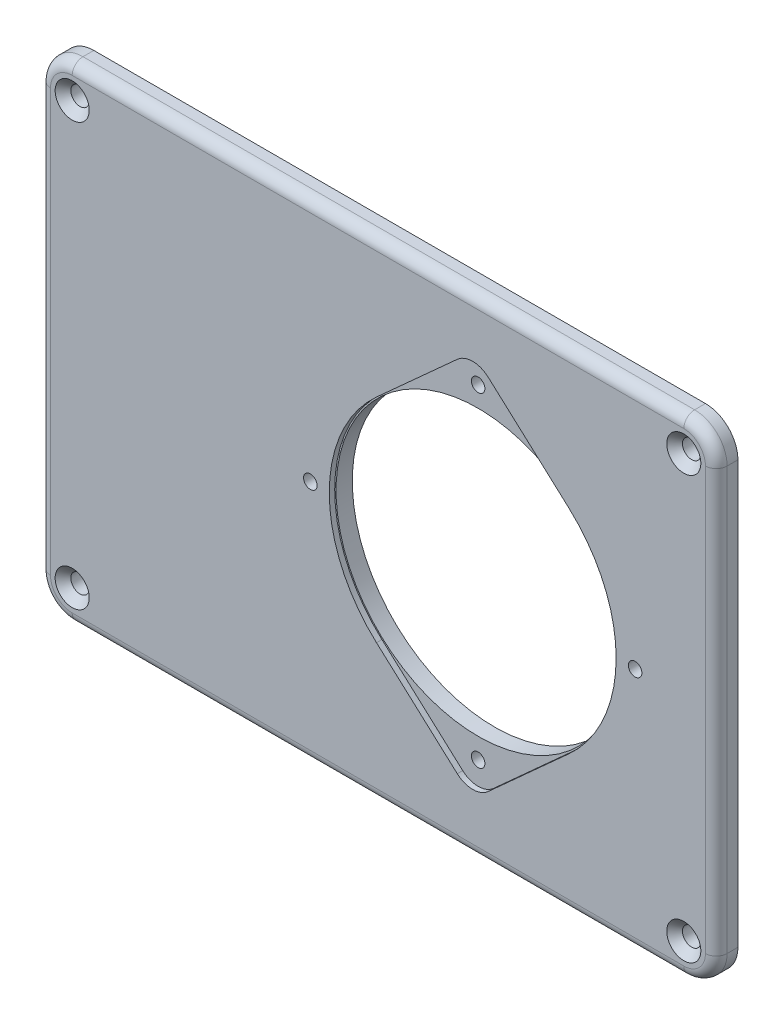
ISO-10303-21;
HEADER;
FILE_DESCRIPTION(('STEP AP214'),'2;1');
FILE_NAME('part.step','',(''),(''),'','','');
FILE_SCHEMA(('AUTOMOTIVE_DESIGN { 1 0 10303 214 1 1 1 1 }'));
ENDSEC;
DATA;
#1=APPLICATION_CONTEXT('core data for automotive mechanical design processes');
#2=APPLICATION_PROTOCOL_DEFINITION('international standard','automotive_design',2000,#1);
#3=PRODUCT_CONTEXT('',#1,'mechanical');
#4=PRODUCT('Part','Part','',(#3));
#5=PRODUCT_RELATED_PRODUCT_CATEGORY('part','',(#4));
#6=PRODUCT_DEFINITION_FORMATION('','',#4);
#7=PRODUCT_DEFINITION_CONTEXT('part definition',#1,'design');
#8=PRODUCT_DEFINITION('design','',#6,#7);
#9=PRODUCT_DEFINITION_SHAPE('','',#8);
#10=(LENGTH_UNIT() NAMED_UNIT(*) SI_UNIT(.MILLI.,.METRE.));
#11=(NAMED_UNIT(*) PLANE_ANGLE_UNIT() SI_UNIT($,.RADIAN.));
#12=(NAMED_UNIT(*) SI_UNIT($,.STERADIAN.) SOLID_ANGLE_UNIT());
#13=UNCERTAINTY_MEASURE_WITH_UNIT(LENGTH_MEASURE(1.E-05),#10,'distance_accuracy_value','');
#14=(GEOMETRIC_REPRESENTATION_CONTEXT(3) GLOBAL_UNCERTAINTY_ASSIGNED_CONTEXT((#13)) GLOBAL_UNIT_ASSIGNED_CONTEXT((#10,
#11,#12)) REPRESENTATION_CONTEXT('',''));
#15=CARTESIAN_POINT('',(0.,0.,0.));
#16=DIRECTION('',(0.,0.,1.));
#17=DIRECTION('',(1.,0.,0.));
#18=AXIS2_PLACEMENT_3D('',#15,#16,#17);
#19=CARTESIAN_POINT('',(17.5,0.,0.));
#20=DIRECTION('',(0.,0.,1.));
#21=DIRECTION('',(1.,0.,0.));
#22=AXIS2_PLACEMENT_3D('',#19,#20,#21);
#23=CYLINDRICAL_SURFACE('',#22,26.25);
#24=CARTESIAN_POINT('',(17.5,0.,0.));
#25=DIRECTION('',(0.,0.,1.));
#26=DIRECTION('',(1.,0.,0.));
#27=AXIS2_PLACEMENT_3D('',#24,#25,#26);
#28=CIRCLE('',#27,26.25);
#29=CARTESIAN_POINT('',(43.75,0.,0.));
#30=VERTEX_POINT('',#29);
#31=EDGE_CURVE('E285',#30,#30,#28,.T.);
#32=ORIENTED_EDGE('',*,*,#31,.F.);
#33=EDGE_LOOP('',(#32));
#34=FACE_BOUND('',#33,.T.);
#35=CARTESIAN_POINT('',(17.5,0.,3.));
#36=DIRECTION('',(0.,0.,1.));
#37=DIRECTION('',(1.,0.,0.));
#38=AXIS2_PLACEMENT_3D('',#35,#36,#37);
#39=CIRCLE('',#38,26.25);
#40=CARTESIAN_POINT('',(43.75,0.,3.));
#41=VERTEX_POINT('',#40);
#42=EDGE_CURVE('E236',#41,#41,#39,.F.);
#43=ORIENTED_EDGE('',*,*,#42,.F.);
#44=EDGE_LOOP('',(#43));
#45=FACE_BOUND('',#44,.T.);
#46=ADVANCED_FACE('F37',(#34,#45),#23,.F.);
#47=CARTESIAN_POINT('',(62.5,45.,4.));
#48=DIRECTION('',(-1.,0.,0.));
#49=DIRECTION('',(0.,0.,1.));
#50=AXIS2_PLACEMENT_3D('',#47,#48,#49);
#51=PLANE('',#50);
#52=DIRECTION('',(0.,0.,-1.));
#53=VECTOR('',#52,1.);
#54=CARTESIAN_POINT('',(62.5,39.,4.));
#55=LINE('',#54,#53);
#56=CARTESIAN_POINT('',(62.5,39.,0.));
#57=VERTEX_POINT('',#56);
#58=CARTESIAN_POINT('',(62.5,39.,2.));
#59=VERTEX_POINT('',#58);
#60=EDGE_CURVE('E318',#57,#59,#55,.F.);
#61=ORIENTED_EDGE('',*,*,#60,.T.);
#62=DIRECTION('',(0.,1.,0.));
#63=VECTOR('',#62,1.);
#64=CARTESIAN_POINT('',(62.5,-39.,2.));
#65=LINE('',#64,#63);
#66=CARTESIAN_POINT('',(62.5,-39.,2.));
#67=VERTEX_POINT('',#66);
#68=EDGE_CURVE('E352',#59,#67,#65,.F.);
#69=ORIENTED_EDGE('',*,*,#68,.T.);
#70=DIRECTION('',(0.,0.,-1.));
#71=VECTOR('',#70,1.);
#72=CARTESIAN_POINT('',(62.5,-39.,4.));
#73=LINE('',#72,#71);
#74=CARTESIAN_POINT('',(62.5,-39.,0.));
#75=VERTEX_POINT('',#74);
#76=EDGE_CURVE('E321',#67,#75,#73,.T.);
#77=ORIENTED_EDGE('',*,*,#76,.T.);
#78=DIRECTION('',(0.,1.,0.));
#79=VECTOR('',#78,1.);
#80=CARTESIAN_POINT('',(62.5,45.,0.));
#81=LINE('',#80,#79);
#82=EDGE_CURVE('E288',#75,#57,#81,.T.);
#83=ORIENTED_EDGE('',*,*,#82,.T.);
#84=EDGE_LOOP('',(#61,#69,#77,#83));
#85=FACE_BOUND('',#84,.T.);
#86=ADVANCED_FACE('F382',(#85),#51,.F.);
#87=CARTESIAN_POINT('',(-62.5,45.,4.));
#88=DIRECTION('',(0.,-1.,0.));
#89=DIRECTION('',(1.,0.,0.));
#90=AXIS2_PLACEMENT_3D('',#87,#88,#89);
#91=PLANE('',#90);
#92=DIRECTION('',(0.,0.,-1.));
#93=VECTOR('',#92,1.);
#94=CARTESIAN_POINT('',(-56.5,45.,4.));
#95=LINE('',#94,#93);
#96=CARTESIAN_POINT('',(-56.5,45.,0.));
#97=VERTEX_POINT('',#96);
#98=CARTESIAN_POINT('',(-56.5,45.,2.));
#99=VERTEX_POINT('',#98);
#100=EDGE_CURVE('E323',#97,#99,#95,.F.);
#101=ORIENTED_EDGE('',*,*,#100,.T.);
#102=DIRECTION('',(-1.,0.,0.));
#103=VECTOR('',#102,1.);
#104=CARTESIAN_POINT('',(56.5,45.,2.));
#105=LINE('',#104,#103);
#106=CARTESIAN_POINT('',(56.5,45.,2.));
#107=VERTEX_POINT('',#106);
#108=EDGE_CURVE('E348',#99,#107,#105,.F.);
#109=ORIENTED_EDGE('',*,*,#108,.T.);
#110=DIRECTION('',(0.,0.,-1.));
#111=VECTOR('',#110,1.);
#112=CARTESIAN_POINT('',(56.5,45.,4.));
#113=LINE('',#112,#111);
#114=CARTESIAN_POINT('',(56.5,45.,0.));
#115=VERTEX_POINT('',#114);
#116=EDGE_CURVE('E326',#107,#115,#113,.T.);
#117=ORIENTED_EDGE('',*,*,#116,.T.);
#118=DIRECTION('',(-1.,0.,0.));
#119=VECTOR('',#118,1.);
#120=CARTESIAN_POINT('',(-62.5,45.,0.));
#121=LINE('',#120,#119);
#122=EDGE_CURVE('E292',#115,#97,#121,.T.);
#123=ORIENTED_EDGE('',*,*,#122,.T.);
#124=EDGE_LOOP('',(#101,#109,#117,#123));
#125=FACE_BOUND('',#124,.T.);
#126=ADVANCED_FACE('F388',(#125),#91,.F.);
#127=CARTESIAN_POINT('',(-62.5,45.,4.));
#128=DIRECTION('',(1.,0.,0.));
#129=DIRECTION('',(0.,1.,0.));
#130=AXIS2_PLACEMENT_3D('',#127,#128,#129);
#131=PLANE('',#130);
#132=DIRECTION('',(0.,0.,-1.));
#133=VECTOR('',#132,1.);
#134=CARTESIAN_POINT('',(-62.5,-39.,4.));
#135=LINE('',#134,#133);
#136=CARTESIAN_POINT('',(-62.5,-38.9999999999999,0.));
#137=VERTEX_POINT('',#136);
#138=CARTESIAN_POINT('',(-62.5,-39.,2.));
#139=VERTEX_POINT('',#138);
#140=EDGE_CURVE('E316',#137,#139,#135,.F.);
#141=ORIENTED_EDGE('',*,*,#140,.T.);
#142=DIRECTION('',(0.,-1.,0.));
#143=VECTOR('',#142,1.);
#144=CARTESIAN_POINT('',(-62.5,39.,2.));
#145=LINE('',#144,#143);
#146=CARTESIAN_POINT('',(-62.5,39.,2.));
#147=VERTEX_POINT('',#146);
#148=EDGE_CURVE('E11',#139,#147,#145,.F.);
#149=ORIENTED_EDGE('',*,*,#148,.T.);
#150=DIRECTION('',(0.,0.,-1.));
#151=VECTOR('',#150,1.);
#152=CARTESIAN_POINT('',(-62.5,39.,4.));
#153=LINE('',#152,#151);
#154=CARTESIAN_POINT('',(-62.5,39.,0.));
#155=VERTEX_POINT('',#154);
#156=EDGE_CURVE('E314',#147,#155,#153,.T.);
#157=ORIENTED_EDGE('',*,*,#156,.T.);
#158=DIRECTION('',(0.,-1.,0.));
#159=VECTOR('',#158,1.);
#160=CARTESIAN_POINT('',(-62.5,45.,0.));
#161=LINE('',#160,#159);
#162=EDGE_CURVE('E295',#155,#137,#161,.T.);
#163=ORIENTED_EDGE('',*,*,#162,.T.);
#164=EDGE_LOOP('',(#141,#149,#157,#163));
#165=FACE_BOUND('',#164,.T.);
#166=ADVANCED_FACE('F408',(#165),#131,.F.);
#167=CARTESIAN_POINT('',(-62.5,-45.,4.));
#168=DIRECTION('',(0.,1.,0.));
#169=DIRECTION('',(0.,0.,1.));
#170=AXIS2_PLACEMENT_3D('',#167,#168,#169);
#171=PLANE('',#170);
#172=DIRECTION('',(0.,0.,-1.));
#173=VECTOR('',#172,1.);
#174=CARTESIAN_POINT('',(56.5,-45.,4.));
#175=LINE('',#174,#173);
#176=CARTESIAN_POINT('',(56.5,-45.,0.));
#177=VERTEX_POINT('',#176);
#178=CARTESIAN_POINT('',(56.5,-45.,2.));
#179=VERTEX_POINT('',#178);
#180=EDGE_CURVE('E301',#177,#179,#175,.F.);
#181=ORIENTED_EDGE('',*,*,#180,.T.);
#182=DIRECTION('',(1.,0.,0.));
#183=VECTOR('',#182,1.);
#184=CARTESIAN_POINT('',(-56.5,-45.,2.));
#185=LINE('',#184,#183);
#186=CARTESIAN_POINT('',(-56.5,-45.,2.));
#187=VERTEX_POINT('',#186);
#188=EDGE_CURVE('E356',#179,#187,#185,.F.);
#189=ORIENTED_EDGE('',*,*,#188,.T.);
#190=DIRECTION('',(0.,0.,-1.));
#191=VECTOR('',#190,1.);
#192=CARTESIAN_POINT('',(-56.5,-45.,4.));
#193=LINE('',#192,#191);
#194=CARTESIAN_POINT('',(-56.5,-45.,0.));
#195=VERTEX_POINT('',#194);
#196=EDGE_CURVE('E304',#187,#195,#193,.T.);
#197=ORIENTED_EDGE('',*,*,#196,.T.);
#198=DIRECTION('',(1.,0.,0.));
#199=VECTOR('',#198,1.);
#200=CARTESIAN_POINT('',(-62.5,-45.,0.));
#201=LINE('',#200,#199);
#202=EDGE_CURVE('E298',#195,#177,#201,.T.);
#203=ORIENTED_EDGE('',*,*,#202,.T.);
#204=EDGE_LOOP('',(#181,#189,#197,#203));
#205=FACE_BOUND('',#204,.T.);
#206=ADVANCED_FACE('F400',(#205),#171,.F.);
#207=CARTESIAN_POINT('',(0.,0.,4.));
#208=DIRECTION('',(0.,0.,1.));
#209=DIRECTION('',(1.,0.,0.));
#210=AXIS2_PLACEMENT_3D('',#207,#208,#209);
#211=PLANE('',#210);
#212=CARTESIAN_POINT('',(47.5,0.,4.));
#213=DIRECTION('',(0.,0.,1.));
#214=DIRECTION('',(1.,0.,0.));
#215=AXIS2_PLACEMENT_3D('',#212,#213,#214);
#216=CIRCLE('',#215,1.24999999999999);
#217=CARTESIAN_POINT('',(48.75,0.,4.));
#218=VERTEX_POINT('',#217);
#219=EDGE_CURVE('E827',#218,#218,#216,.T.);
#220=ORIENTED_EDGE('',*,*,#219,.F.);
#221=EDGE_LOOP('',(#220));
#222=FACE_BOUND('',#221,.T.);
#223=CARTESIAN_POINT('',(-12.5,0.,4.));
#224=DIRECTION('',(0.,0.,1.));
#225=DIRECTION('',(1.,0.,0.));
#226=AXIS2_PLACEMENT_3D('',#223,#224,#225);
#227=CIRCLE('',#226,1.24999999999999);
#228=CARTESIAN_POINT('',(-11.25,0.,4.));
#229=VERTEX_POINT('',#228);
#230=EDGE_CURVE('E837',#229,#229,#227,.T.);
#231=ORIENTED_EDGE('',*,*,#230,.F.);
#232=EDGE_LOOP('',(#231));
#233=FACE_BOUND('',#232,.T.);
#234=CARTESIAN_POINT('',(17.5,0.,4.));
#235=DIRECTION('',(0.,0.,1.));
#236=DIRECTION('',(1.,0.,0.));
#237=AXIS2_PLACEMENT_3D('',#234,#235,#236);
#238=CIRCLE('',#237,26.5);
#239=CARTESIAN_POINT('',(-0.275368706130652,19.6541666666667,4.));
#240=VERTEX_POINT('',#239);
#241=CARTESIAN_POINT('',(-0.275368706130652,-19.6541666666667,4.));
#242=VERTEX_POINT('',#241);
#243=EDGE_CURVE('E54',#240,#242,#238,.T.);
#244=ORIENTED_EDGE('',*,*,#243,.F.);
#245=DIRECTION('',(0.741666666666667,0.670768630420024,0.));
#246=VECTOR('',#245,1.);
#247=CARTESIAN_POINT('',(-0.275368706130652,19.6541666666667,4.));
#248=LINE('',#247,#246);
#249=CARTESIAN_POINT('',(14.6492333207149,33.1520833333333,4.));
#250=VERTEX_POINT('',#249);
#251=EDGE_CURVE('E197',#240,#250,#248,.T.);
#252=ORIENTED_EDGE('',*,*,#251,.T.);
#253=CARTESIAN_POINT('',(17.5,30.,4.));
#254=DIRECTION('',(0.,0.,1.));
#255=DIRECTION('',(1.,0.,0.));
#256=AXIS2_PLACEMENT_3D('',#253,#254,#255);
#257=CIRCLE('',#256,4.25);
#258=CARTESIAN_POINT('',(20.3507666792851,33.1520833333333,4.));
#259=VERTEX_POINT('',#258);
#260=EDGE_CURVE('E200',#259,#250,#257,.T.);
#261=ORIENTED_EDGE('',*,*,#260,.F.);
#262=DIRECTION('',(0.741666666666667,-0.670768630420024,0.));
#263=VECTOR('',#262,1.);
#264=CARTESIAN_POINT('',(20.3507666792851,33.1520833333333,4.));
#265=LINE('',#264,#263);
#266=CARTESIAN_POINT('',(35.2753687061307,19.6541666666667,4.));
#267=VERTEX_POINT('',#266);
#268=EDGE_CURVE('E229',#259,#267,#265,.T.);
#269=ORIENTED_EDGE('',*,*,#268,.T.);
#270=CARTESIAN_POINT('',(17.5,0.,4.));
#271=DIRECTION('',(0.,0.,1.));
#272=DIRECTION('',(1.,0.,0.));
#273=AXIS2_PLACEMENT_3D('',#270,#271,#272);
#274=CIRCLE('',#273,26.5);
#275=CARTESIAN_POINT('',(35.2753687061306,-19.6541666666667,4.));
#276=VERTEX_POINT('',#275);
#277=EDGE_CURVE('E226',#276,#267,#274,.T.);
#278=ORIENTED_EDGE('',*,*,#277,.F.);
#279=DIRECTION('',(-0.741666666666667,-0.670768630420025,0.));
#280=VECTOR('',#279,1.);
#281=CARTESIAN_POINT('',(35.2753687061307,-19.6541666666667,4.));
#282=LINE('',#281,#280);
#283=CARTESIAN_POINT('',(20.3507666792851,-33.1520833333333,4.));
#284=VERTEX_POINT('',#283);
#285=EDGE_CURVE('E223',#276,#284,#282,.T.);
#286=ORIENTED_EDGE('',*,*,#285,.T.);
#287=CARTESIAN_POINT('',(17.5,-30.,4.));
#288=DIRECTION('',(0.,0.,1.));
#289=DIRECTION('',(1.,0.,0.));
#290=AXIS2_PLACEMENT_3D('',#287,#288,#289);
#291=CIRCLE('',#290,4.25);
#292=CARTESIAN_POINT('',(14.6492333207149,-33.1520833333333,4.));
#293=VERTEX_POINT('',#292);
#294=EDGE_CURVE('E220',#293,#284,#291,.T.);
#295=ORIENTED_EDGE('',*,*,#294,.F.);
#296=DIRECTION('',(0.741666666666666,-0.670768630420025,0.));
#297=VECTOR('',#296,1.);
#298=CARTESIAN_POINT('',(-0.275368706130652,-19.6541666666667,4.));
#299=LINE('',#298,#297);
#300=EDGE_CURVE('E218',#242,#293,#299,.T.);
#301=ORIENTED_EDGE('',*,*,#300,.F.);
#302=EDGE_LOOP('',(#244,#252,#261,#269,#278,#286,#295,#301));
#303=FACE_BOUND('',#302,.T.);
#304=CARTESIAN_POINT('',(-56.5,39.,4.));
#305=DIRECTION('',(0.,0.,1.));
#306=DIRECTION('',(1.,0.,0.));
#307=AXIS2_PLACEMENT_3D('',#304,#305,#306);
#308=CIRCLE('',#307,3.15);
#309=CARTESIAN_POINT('',(-53.35,39.,4.));
#310=VERTEX_POINT('',#309);
#311=EDGE_CURVE('E248',#310,#310,#308,.T.);
#312=ORIENTED_EDGE('',*,*,#311,.F.);
#313=EDGE_LOOP('',(#312));
#314=FACE_BOUND('',#313,.T.);
#315=CARTESIAN_POINT('',(56.5,39.,4.));
#316=DIRECTION('',(0.,0.,1.));
#317=DIRECTION('',(1.,0.,0.));
#318=AXIS2_PLACEMENT_3D('',#315,#316,#317);
#319=CIRCLE('',#318,3.15);
#320=CARTESIAN_POINT('',(59.65,39.,4.));
#321=VERTEX_POINT('',#320);
#322=EDGE_CURVE('E257',#321,#321,#319,.T.);
#323=ORIENTED_EDGE('',*,*,#322,.F.);
#324=EDGE_LOOP('',(#323));
#325=FACE_BOUND('',#324,.T.);
#326=CARTESIAN_POINT('',(56.5,-39.,4.));
#327=DIRECTION('',(0.,0.,1.));
#328=DIRECTION('',(1.,0.,0.));
#329=AXIS2_PLACEMENT_3D('',#326,#327,#328);
#330=CIRCLE('',#329,3.15);
#331=CARTESIAN_POINT('',(59.65,-39.,4.));
#332=VERTEX_POINT('',#331);
#333=EDGE_CURVE('E266',#332,#332,#330,.T.);
#334=ORIENTED_EDGE('',*,*,#333,.F.);
#335=EDGE_LOOP('',(#334));
#336=FACE_BOUND('',#335,.T.);
#337=CARTESIAN_POINT('',(-56.5,-39.,4.));
#338=DIRECTION('',(0.,0.,1.));
#339=DIRECTION('',(1.,0.,0.));
#340=AXIS2_PLACEMENT_3D('',#337,#338,#339);
#341=CIRCLE('',#340,3.15);
#342=CARTESIAN_POINT('',(-53.35,-39.,4.));
#343=VERTEX_POINT('',#342);
#344=EDGE_CURVE('E275',#343,#343,#341,.T.);
#345=ORIENTED_EDGE('',*,*,#344,.F.);
#346=EDGE_LOOP('',(#345));
#347=FACE_BOUND('',#346,.T.);
#348=DIRECTION('',(-1.,0.,0.));
#349=VECTOR('',#348,1.);
#350=CARTESIAN_POINT('',(-56.5,43.,4.));
#351=LINE('',#350,#349);
#352=CARTESIAN_POINT('',(56.5,43.,4.));
#353=VERTEX_POINT('',#352);
#354=CARTESIAN_POINT('',(-56.5,43.,4.));
#355=VERTEX_POINT('',#354);
#356=EDGE_CURVE('E340',#353,#355,#351,.T.);
#357=ORIENTED_EDGE('',*,*,#356,.T.);
#358=CARTESIAN_POINT('',(-56.5,39.,4.));
#359=DIRECTION('',(0.,0.,1.));
#360=DIRECTION('',(1.,0.,0.));
#361=AXIS2_PLACEMENT_3D('',#358,#359,#360);
#362=CIRCLE('',#361,4.);
#363=CARTESIAN_POINT('',(-60.5,39.,4.));
#364=VERTEX_POINT('',#363);
#365=EDGE_CURVE('E342',#355,#364,#362,.T.);
#366=ORIENTED_EDGE('',*,*,#365,.T.);
#367=DIRECTION('',(0.,-1.,0.));
#368=VECTOR('',#367,1.);
#369=CARTESIAN_POINT('',(-60.5,-38.9999999999999,4.));
#370=LINE('',#369,#368);
#371=CARTESIAN_POINT('',(-60.5,-39.,4.));
#372=VERTEX_POINT('',#371);
#373=EDGE_CURVE('E328',#364,#372,#370,.T.);
#374=ORIENTED_EDGE('',*,*,#373,.T.);
#375=CARTESIAN_POINT('',(-56.5,-39.,4.));
#376=DIRECTION('',(0.,0.,1.));
#377=DIRECTION('',(1.,0.,0.));
#378=AXIS2_PLACEMENT_3D('',#375,#376,#377);
#379=CIRCLE('',#378,4.);
#380=CARTESIAN_POINT('',(-56.5,-43.,4.));
#381=VERTEX_POINT('',#380);
#382=EDGE_CURVE('E330',#372,#381,#379,.T.);
#383=ORIENTED_EDGE('',*,*,#382,.T.);
#384=DIRECTION('',(1.,0.,0.));
#385=VECTOR('',#384,1.);
#386=CARTESIAN_POINT('',(56.5,-43.,4.));
#387=LINE('',#386,#385);
#388=CARTESIAN_POINT('',(56.5,-43.,4.));
#389=VERTEX_POINT('',#388);
#390=EDGE_CURVE('E332',#381,#389,#387,.T.);
#391=ORIENTED_EDGE('',*,*,#390,.T.);
#392=CARTESIAN_POINT('',(56.5,-39.,4.));
#393=DIRECTION('',(0.,0.,1.));
#394=DIRECTION('',(1.,0.,0.));
#395=AXIS2_PLACEMENT_3D('',#392,#393,#394);
#396=CIRCLE('',#395,4.);
#397=CARTESIAN_POINT('',(60.5,-39.,4.));
#398=VERTEX_POINT('',#397);
#399=EDGE_CURVE('E334',#389,#398,#396,.T.);
#400=ORIENTED_EDGE('',*,*,#399,.T.);
#401=DIRECTION('',(0.,1.,0.));
#402=VECTOR('',#401,1.);
#403=CARTESIAN_POINT('',(60.5,39.,4.));
#404=LINE('',#403,#402);
#405=CARTESIAN_POINT('',(60.5,39.,4.));
#406=VERTEX_POINT('',#405);
#407=EDGE_CURVE('E336',#398,#406,#404,.T.);
#408=ORIENTED_EDGE('',*,*,#407,.T.);
#409=CARTESIAN_POINT('',(56.5,39.,4.));
#410=DIRECTION('',(0.,0.,1.));
#411=DIRECTION('',(1.,0.,0.));
#412=AXIS2_PLACEMENT_3D('',#409,#410,#411);
#413=CIRCLE('',#412,4.);
#414=EDGE_CURVE('E338',#406,#353,#413,.T.);
#415=ORIENTED_EDGE('',*,*,#414,.T.);
#416=EDGE_LOOP('',(#357,#366,#374,#383,#391,#400,#408,#415));
#417=FACE_BOUND('',#416,.T.);
#418=ADVANCED_FACE('F396',(#222,#233,#303,#314,#325,#336,#347,#417),#211,.T.);
#419=CARTESIAN_POINT('',(0.,0.,0.));
#420=DIRECTION('',(0.,0.,1.));
#421=DIRECTION('',(1.,0.,0.));
#422=AXIS2_PLACEMENT_3D('',#419,#420,#421);
#423=PLANE('',#422);
#424=CARTESIAN_POINT('',(17.5,30.,0.));
#425=DIRECTION('',(0.,0.,1.));
#426=DIRECTION('',(1.,0.,0.));
#427=AXIS2_PLACEMENT_3D('',#424,#425,#426);
#428=CIRCLE('',#427,1.25);
#429=CARTESIAN_POINT('',(18.75,30.,0.));
#430=VERTEX_POINT('',#429);
#431=EDGE_CURVE('E825',#430,#430,#428,.T.);
#432=ORIENTED_EDGE('',*,*,#431,.T.);
#433=EDGE_LOOP('',(#432));
#434=FACE_BOUND('',#433,.T.);
#435=CARTESIAN_POINT('',(47.5,0.,0.));
#436=DIRECTION('',(0.,0.,1.));
#437=DIRECTION('',(1.,0.,0.));
#438=AXIS2_PLACEMENT_3D('',#435,#436,#437);
#439=CIRCLE('',#438,1.25);
#440=CARTESIAN_POINT('',(48.75,0.,0.));
#441=VERTEX_POINT('',#440);
#442=EDGE_CURVE('E832',#441,#441,#439,.T.);
#443=ORIENTED_EDGE('',*,*,#442,.T.);
#444=EDGE_LOOP('',(#443));
#445=FACE_BOUND('',#444,.T.);
#446=CARTESIAN_POINT('',(17.5,-30.,0.));
#447=DIRECTION('',(0.,0.,1.));
#448=DIRECTION('',(1.,0.,0.));
#449=AXIS2_PLACEMENT_3D('',#446,#447,#448);
#450=CIRCLE('',#449,1.25);
#451=CARTESIAN_POINT('',(18.75,-30.,0.));
#452=VERTEX_POINT('',#451);
#453=EDGE_CURVE('E835',#452,#452,#450,.T.);
#454=ORIENTED_EDGE('',*,*,#453,.T.);
#455=EDGE_LOOP('',(#454));
#456=FACE_BOUND('',#455,.T.);
#457=CARTESIAN_POINT('',(-12.5,0.,0.));
#458=DIRECTION('',(0.,0.,1.));
#459=DIRECTION('',(1.,0.,0.));
#460=AXIS2_PLACEMENT_3D('',#457,#458,#459);
#461=CIRCLE('',#460,1.25);
#462=CARTESIAN_POINT('',(-11.25,0.,0.));
#463=VERTEX_POINT('',#462);
#464=EDGE_CURVE('E203',#463,#463,#461,.T.);
#465=ORIENTED_EDGE('',*,*,#464,.T.);
#466=EDGE_LOOP('',(#465));
#467=FACE_BOUND('',#466,.T.);
#468=CARTESIAN_POINT('',(-56.5,39.,0.));
#469=DIRECTION('',(0.,0.,1.));
#470=DIRECTION('',(1.,0.,0.));
#471=AXIS2_PLACEMENT_3D('',#468,#469,#470);
#472=CIRCLE('',#471,1.7);
#473=CARTESIAN_POINT('',(-54.8,39.,0.));
#474=VERTEX_POINT('',#473);
#475=EDGE_CURVE('E254',#474,#474,#472,.T.);
#476=ORIENTED_EDGE('',*,*,#475,.T.);
#477=EDGE_LOOP('',(#476));
#478=FACE_BOUND('',#477,.T.);
#479=CARTESIAN_POINT('',(56.5,39.,0.));
#480=DIRECTION('',(0.,0.,1.));
#481=DIRECTION('',(1.,0.,0.));
#482=AXIS2_PLACEMENT_3D('',#479,#480,#481);
#483=CIRCLE('',#482,1.7);
#484=CARTESIAN_POINT('',(58.2,39.,0.));
#485=VERTEX_POINT('',#484);
#486=EDGE_CURVE('E263',#485,#485,#483,.T.);
#487=ORIENTED_EDGE('',*,*,#486,.T.);
#488=EDGE_LOOP('',(#487));
#489=FACE_BOUND('',#488,.T.);
#490=CARTESIAN_POINT('',(56.5,-39.,0.));
#491=DIRECTION('',(0.,0.,1.));
#492=DIRECTION('',(1.,0.,0.));
#493=AXIS2_PLACEMENT_3D('',#490,#491,#492);
#494=CIRCLE('',#493,1.7);
#495=CARTESIAN_POINT('',(58.2,-39.,0.));
#496=VERTEX_POINT('',#495);
#497=EDGE_CURVE('E272',#496,#496,#494,.T.);
#498=ORIENTED_EDGE('',*,*,#497,.T.);
#499=EDGE_LOOP('',(#498));
#500=FACE_BOUND('',#499,.T.);
#501=CARTESIAN_POINT('',(-56.5,-39.,0.));
#502=DIRECTION('',(0.,0.,1.));
#503=DIRECTION('',(1.,0.,0.));
#504=AXIS2_PLACEMENT_3D('',#501,#502,#503);
#505=CIRCLE('',#504,1.7);
#506=CARTESIAN_POINT('',(-54.8,-39.,0.));
#507=VERTEX_POINT('',#506);
#508=EDGE_CURVE('E281',#507,#507,#505,.T.);
#509=ORIENTED_EDGE('',*,*,#508,.T.);
#510=EDGE_LOOP('',(#509));
#511=FACE_BOUND('',#510,.T.);
#512=ORIENTED_EDGE('',*,*,#31,.T.);
#513=EDGE_LOOP('',(#512));
#514=FACE_BOUND('',#513,.T.);
#515=ORIENTED_EDGE('',*,*,#202,.F.);
#516=CARTESIAN_POINT('',(-56.5,-39.,0.));
#517=DIRECTION('',(0.,0.,1.));
#518=DIRECTION('',(1.,0.,0.));
#519=AXIS2_PLACEMENT_3D('',#516,#517,#518);
#520=CIRCLE('',#519,6.);
#521=EDGE_CURVE('E312',#195,#137,#520,.F.);
#522=ORIENTED_EDGE('',*,*,#521,.T.);
#523=ORIENTED_EDGE('',*,*,#162,.F.);
#524=CARTESIAN_POINT('',(-56.5,39.,0.));
#525=DIRECTION('',(0.,0.,1.));
#526=DIRECTION('',(1.,0.,0.));
#527=AXIS2_PLACEMENT_3D('',#524,#525,#526);
#528=CIRCLE('',#527,6.);
#529=EDGE_CURVE('E306',#155,#97,#528,.F.);
#530=ORIENTED_EDGE('',*,*,#529,.T.);
#531=ORIENTED_EDGE('',*,*,#122,.F.);
#532=CARTESIAN_POINT('',(56.5,39.,0.));
#533=DIRECTION('',(0.,0.,1.));
#534=DIRECTION('',(1.,0.,0.));
#535=AXIS2_PLACEMENT_3D('',#532,#533,#534);
#536=CIRCLE('',#535,6.);
#537=EDGE_CURVE('E308',#115,#57,#536,.F.);
#538=ORIENTED_EDGE('',*,*,#537,.T.);
#539=ORIENTED_EDGE('',*,*,#82,.F.);
#540=CARTESIAN_POINT('',(56.5,-39.,0.));
#541=DIRECTION('',(0.,0.,1.));
#542=DIRECTION('',(1.,0.,0.));
#543=AXIS2_PLACEMENT_3D('',#540,#541,#542);
#544=CIRCLE('',#543,6.);
#545=EDGE_CURVE('E310',#75,#177,#544,.F.);
#546=ORIENTED_EDGE('',*,*,#545,.T.);
#547=EDGE_LOOP('',(#515,#522,#523,#530,#531,#538,#539,#546));
#548=FACE_BOUND('',#547,.T.);
#549=ADVANCED_FACE('F399',(#434,#445,#456,#467,#478,#489,#500,#511,#514,#548),#423,.F.);
#550=CARTESIAN_POINT('',(-56.5,-39.,4.));
#551=DIRECTION('',(0.,0.,-1.));
#552=DIRECTION('',(-1.,0.,0.));
#553=AXIS2_PLACEMENT_3D('',#550,#551,#552);
#554=CYLINDRICAL_SURFACE('',#553,6.);
#555=ORIENTED_EDGE('',*,*,#196,.F.);
#556=CARTESIAN_POINT('',(-56.5,-39.,2.));
#557=DIRECTION('',(0.,0.,1.));
#558=DIRECTION('',(1.,0.,0.));
#559=AXIS2_PLACEMENT_3D('',#556,#557,#558);
#560=CIRCLE('',#559,6.);
#561=EDGE_CURVE('E46',#187,#139,#560,.F.);
#562=ORIENTED_EDGE('',*,*,#561,.T.);
#563=ORIENTED_EDGE('',*,*,#140,.F.);
#564=ORIENTED_EDGE('',*,*,#521,.F.);
#565=EDGE_LOOP('',(#555,#562,#563,#564));
#566=FACE_BOUND('',#565,.T.);
#567=ADVANCED_FACE('F404',(#566),#554,.T.);
#568=CARTESIAN_POINT('',(56.5,-39.,4.));
#569=DIRECTION('',(0.,0.,-1.));
#570=DIRECTION('',(-1.,0.,0.));
#571=AXIS2_PLACEMENT_3D('',#568,#569,#570);
#572=CYLINDRICAL_SURFACE('',#571,6.);
#573=ORIENTED_EDGE('',*,*,#76,.F.);
#574=CARTESIAN_POINT('',(56.5,-39.,2.));
#575=DIRECTION('',(0.,0.,1.));
#576=DIRECTION('',(1.,0.,0.));
#577=AXIS2_PLACEMENT_3D('',#574,#575,#576);
#578=CIRCLE('',#577,6.);
#579=EDGE_CURVE('E354',#67,#179,#578,.F.);
#580=ORIENTED_EDGE('',*,*,#579,.T.);
#581=ORIENTED_EDGE('',*,*,#180,.F.);
#582=ORIENTED_EDGE('',*,*,#545,.F.);
#583=EDGE_LOOP('',(#573,#580,#581,#582));
#584=FACE_BOUND('',#583,.T.);
#585=ADVANCED_FACE('F418',(#584),#572,.T.);
#586=CARTESIAN_POINT('',(56.5,39.,4.));
#587=DIRECTION('',(0.,0.,-1.));
#588=DIRECTION('',(-1.,0.,0.));
#589=AXIS2_PLACEMENT_3D('',#586,#587,#588);
#590=CYLINDRICAL_SURFACE('',#589,6.);
#591=ORIENTED_EDGE('',*,*,#116,.F.);
#592=CARTESIAN_POINT('',(56.5,39.,2.));
#593=DIRECTION('',(0.,0.,1.));
#594=DIRECTION('',(1.,0.,0.));
#595=AXIS2_PLACEMENT_3D('',#592,#593,#594);
#596=CIRCLE('',#595,6.);
#597=EDGE_CURVE('E350',#107,#59,#596,.F.);
#598=ORIENTED_EDGE('',*,*,#597,.T.);
#599=ORIENTED_EDGE('',*,*,#60,.F.);
#600=ORIENTED_EDGE('',*,*,#537,.F.);
#601=EDGE_LOOP('',(#591,#598,#599,#600));
#602=FACE_BOUND('',#601,.T.);
#603=ADVANCED_FACE('F421',(#602),#590,.T.);
#604=CARTESIAN_POINT('',(-56.5,39.,4.));
#605=DIRECTION('',(0.,0.,-1.));
#606=DIRECTION('',(-1.,0.,0.));
#607=AXIS2_PLACEMENT_3D('',#604,#605,#606);
#608=CYLINDRICAL_SURFACE('',#607,6.);
#609=ORIENTED_EDGE('',*,*,#156,.F.);
#610=CARTESIAN_POINT('',(-56.5,39.,2.));
#611=DIRECTION('',(0.,0.,1.));
#612=DIRECTION('',(1.,0.,0.));
#613=AXIS2_PLACEMENT_3D('',#610,#611,#612);
#614=CIRCLE('',#613,6.);
#615=EDGE_CURVE('E345',#147,#99,#614,.F.);
#616=ORIENTED_EDGE('',*,*,#615,.T.);
#617=ORIENTED_EDGE('',*,*,#100,.F.);
#618=ORIENTED_EDGE('',*,*,#529,.F.);
#619=EDGE_LOOP('',(#609,#616,#617,#618));
#620=FACE_BOUND('',#619,.T.);
#621=ADVANCED_FACE('F425',(#620),#608,.T.);
#622=CARTESIAN_POINT('',(56.5,-39.,2.));
#623=DIRECTION('',(0.,0.,1.));
#624=DIRECTION('',(1.,0.,0.));
#625=AXIS2_PLACEMENT_3D('',#622,#623,#624);
#626=TOROIDAL_SURFACE('',#625,4.,2.);
#627=CARTESIAN_POINT('',(56.5,-43.,2.));
#628=DIRECTION('',(-1.,0.,0.));
#629=DIRECTION('',(0.,0.,1.));
#630=AXIS2_PLACEMENT_3D('',#627,#628,#629);
#631=CIRCLE('',#630,2.);
#632=EDGE_CURVE('E374',#179,#389,#631,.T.);
#633=ORIENTED_EDGE('',*,*,#632,.F.);
#634=ORIENTED_EDGE('',*,*,#579,.F.);
#635=CARTESIAN_POINT('',(60.5,-39.,2.));
#636=DIRECTION('',(0.,1.,0.));
#637=DIRECTION('',(0.,0.,1.));
#638=AXIS2_PLACEMENT_3D('',#635,#636,#637);
#639=CIRCLE('',#638,2.);
#640=EDGE_CURVE('E289',#398,#67,#639,.T.);
#641=ORIENTED_EDGE('',*,*,#640,.F.);
#642=ORIENTED_EDGE('',*,*,#399,.F.);
#643=EDGE_LOOP('',(#633,#634,#641,#642));
#644=FACE_BOUND('',#643,.T.);
#645=ADVANCED_FACE('F39',(#644),#626,.T.);
#646=CARTESIAN_POINT('',(60.5,0.,2.));
#647=DIRECTION('',(0.,-1.,0.));
#648=DIRECTION('',(0.,0.,-1.));
#649=AXIS2_PLACEMENT_3D('',#646,#647,#648);
#650=CYLINDRICAL_SURFACE('',#649,2.);
#651=ORIENTED_EDGE('',*,*,#640,.T.);
#652=ORIENTED_EDGE('',*,*,#68,.F.);
#653=CARTESIAN_POINT('',(60.5,39.,2.));
#654=DIRECTION('',(0.,1.,0.));
#655=DIRECTION('',(0.,0.,1.));
#656=AXIS2_PLACEMENT_3D('',#653,#654,#655);
#657=CIRCLE('',#656,2.);
#658=EDGE_CURVE('E371',#406,#59,#657,.T.);
#659=ORIENTED_EDGE('',*,*,#658,.F.);
#660=ORIENTED_EDGE('',*,*,#407,.F.);
#661=EDGE_LOOP('',(#651,#652,#659,#660));
#662=FACE_BOUND('',#661,.T.);
#663=ADVANCED_FACE('F452',(#662),#650,.T.);
#664=CARTESIAN_POINT('',(0.,-43.,2.));
#665=DIRECTION('',(-1.,0.,0.));
#666=DIRECTION('',(0.,0.,1.));
#667=AXIS2_PLACEMENT_3D('',#664,#665,#666);
#668=CYLINDRICAL_SURFACE('',#667,2.);
#669=ORIENTED_EDGE('',*,*,#632,.T.);
#670=ORIENTED_EDGE('',*,*,#390,.F.);
#671=CARTESIAN_POINT('',(-56.5,-43.,2.));
#672=DIRECTION('',(-1.,0.,0.));
#673=DIRECTION('',(0.,0.,1.));
#674=AXIS2_PLACEMENT_3D('',#671,#672,#673);
#675=CIRCLE('',#674,2.);
#676=EDGE_CURVE('E368',#187,#381,#675,.T.);
#677=ORIENTED_EDGE('',*,*,#676,.F.);
#678=ORIENTED_EDGE('',*,*,#188,.F.);
#679=EDGE_LOOP('',(#669,#670,#677,#678));
#680=FACE_BOUND('',#679,.T.);
#681=ADVANCED_FACE('F449',(#680),#668,.T.);
#682=CARTESIAN_POINT('',(56.5,39.,2.));
#683=DIRECTION('',(0.,0.,1.));
#684=DIRECTION('',(1.,0.,0.));
#685=AXIS2_PLACEMENT_3D('',#682,#683,#684);
#686=TOROIDAL_SURFACE('',#685,4.,2.);
#687=ORIENTED_EDGE('',*,*,#658,.T.);
#688=ORIENTED_EDGE('',*,*,#597,.F.);
#689=CARTESIAN_POINT('',(56.5,43.,2.));
#690=DIRECTION('',(-1.,0.,0.));
#691=DIRECTION('',(0.,0.,1.));
#692=AXIS2_PLACEMENT_3D('',#689,#690,#691);
#693=CIRCLE('',#692,2.);
#694=EDGE_CURVE('E365',#353,#107,#693,.T.);
#695=ORIENTED_EDGE('',*,*,#694,.F.);
#696=ORIENTED_EDGE('',*,*,#414,.F.);
#697=EDGE_LOOP('',(#687,#688,#695,#696));
#698=FACE_BOUND('',#697,.T.);
#699=ADVANCED_FACE('F445',(#698),#686,.T.);
#700=CARTESIAN_POINT('',(-56.5,-39.,2.));
#701=DIRECTION('',(0.,0.,1.));
#702=DIRECTION('',(1.,0.,0.));
#703=AXIS2_PLACEMENT_3D('',#700,#701,#702);
#704=TOROIDAL_SURFACE('',#703,4.,2.);
#705=ORIENTED_EDGE('',*,*,#676,.T.);
#706=ORIENTED_EDGE('',*,*,#382,.F.);
#707=CARTESIAN_POINT('',(-60.5,-39.,2.));
#708=DIRECTION('',(0.,1.,0.));
#709=DIRECTION('',(0.,0.,1.));
#710=AXIS2_PLACEMENT_3D('',#707,#708,#709);
#711=CIRCLE('',#710,2.);
#712=EDGE_CURVE('E362',#139,#372,#711,.T.);
#713=ORIENTED_EDGE('',*,*,#712,.F.);
#714=ORIENTED_EDGE('',*,*,#561,.F.);
#715=EDGE_LOOP('',(#705,#706,#713,#714));
#716=FACE_BOUND('',#715,.T.);
#717=ADVANCED_FACE('F441',(#716),#704,.T.);
#718=CARTESIAN_POINT('',(0.,43.,2.));
#719=DIRECTION('',(1.,0.,0.));
#720=DIRECTION('',(0.,1.,0.));
#721=AXIS2_PLACEMENT_3D('',#718,#719,#720);
#722=CYLINDRICAL_SURFACE('',#721,2.);
#723=ORIENTED_EDGE('',*,*,#694,.T.);
#724=ORIENTED_EDGE('',*,*,#108,.F.);
#725=CARTESIAN_POINT('',(-56.5,43.,2.));
#726=DIRECTION('',(-1.,0.,0.));
#727=DIRECTION('',(0.,0.,1.));
#728=AXIS2_PLACEMENT_3D('',#725,#726,#727);
#729=CIRCLE('',#728,2.);
#730=EDGE_CURVE('E360',#355,#99,#729,.T.);
#731=ORIENTED_EDGE('',*,*,#730,.F.);
#732=ORIENTED_EDGE('',*,*,#356,.F.);
#733=EDGE_LOOP('',(#723,#724,#731,#732));
#734=FACE_BOUND('',#733,.T.);
#735=ADVANCED_FACE('F437',(#734),#722,.T.);
#736=CARTESIAN_POINT('',(-60.5,0.,2.));
#737=DIRECTION('',(0.,1.,0.));
#738=DIRECTION('',(-1.,0.,0.));
#739=AXIS2_PLACEMENT_3D('',#736,#737,#738);
#740=CYLINDRICAL_SURFACE('',#739,2.);
#741=ORIENTED_EDGE('',*,*,#712,.T.);
#742=ORIENTED_EDGE('',*,*,#373,.F.);
#743=CARTESIAN_POINT('',(-60.5,39.,2.));
#744=DIRECTION('',(0.,1.,0.));
#745=DIRECTION('',(0.,0.,1.));
#746=AXIS2_PLACEMENT_3D('',#743,#744,#745);
#747=CIRCLE('',#746,2.);
#748=EDGE_CURVE('E284',#147,#364,#747,.T.);
#749=ORIENTED_EDGE('',*,*,#748,.F.);
#750=ORIENTED_EDGE('',*,*,#148,.F.);
#751=EDGE_LOOP('',(#741,#742,#749,#750));
#752=FACE_BOUND('',#751,.T.);
#753=ADVANCED_FACE('F433',(#752),#740,.T.);
#754=CARTESIAN_POINT('',(-56.5,39.,2.));
#755=DIRECTION('',(0.,0.,1.));
#756=DIRECTION('',(1.,0.,0.));
#757=AXIS2_PLACEMENT_3D('',#754,#755,#756);
#758=TOROIDAL_SURFACE('',#757,4.,2.);
#759=ORIENTED_EDGE('',*,*,#730,.T.);
#760=ORIENTED_EDGE('',*,*,#615,.F.);
#761=ORIENTED_EDGE('',*,*,#748,.T.);
#762=ORIENTED_EDGE('',*,*,#365,.F.);
#763=EDGE_LOOP('',(#759,#760,#761,#762));
#764=FACE_BOUND('',#763,.T.);
#765=ADVANCED_FACE('F430',(#764),#758,.T.);
#766=CARTESIAN_POINT('',(-56.5,-39.,4.));
#767=DIRECTION('',(0.,0.,1.));
#768=DIRECTION('',(1.,0.,0.));
#769=AXIS2_PLACEMENT_3D('',#766,#767,#768);
#770=CYLINDRICAL_SURFACE('',#769,1.7);
#771=ORIENTED_EDGE('',*,*,#508,.F.);
#772=EDGE_LOOP('',(#771));
#773=FACE_BOUND('',#772,.T.);
#774=CARTESIAN_POINT('',(-56.5,-39.,2.55));
#775=DIRECTION('',(0.,0.,1.));
#776=DIRECTION('',(1.,0.,0.));
#777=AXIS2_PLACEMENT_3D('',#774,#775,#776);
#778=CIRCLE('',#777,1.7);
#779=CARTESIAN_POINT('',(-54.8,-39.,2.55));
#780=VERTEX_POINT('',#779);
#781=EDGE_CURVE('E278',#780,#780,#778,.T.);
#782=ORIENTED_EDGE('',*,*,#781,.T.);
#783=EDGE_LOOP('',(#782));
#784=FACE_BOUND('',#783,.T.);
#785=ADVANCED_FACE('F394',(#773,#784),#770,.F.);
#786=CARTESIAN_POINT('',(-56.5,-39.,4.));
#787=DIRECTION('',(0.,0.,1.));
#788=DIRECTION('',(1.,0.,0.));
#789=AXIS2_PLACEMENT_3D('',#786,#787,#788);
#790=CONICAL_SURFACE('',#789,3.15,0.785398163397449);
#791=ORIENTED_EDGE('',*,*,#781,.F.);
#792=EDGE_LOOP('',(#791));
#793=FACE_BOUND('',#792,.T.);
#794=ORIENTED_EDGE('',*,*,#344,.T.);
#795=EDGE_LOOP('',(#794));
#796=FACE_BOUND('',#795,.T.);
#797=ADVANCED_FACE('F615',(#793,#796),#790,.F.);
#798=CARTESIAN_POINT('',(56.5,-39.,4.));
#799=DIRECTION('',(0.,0.,1.));
#800=DIRECTION('',(1.,0.,0.));
#801=AXIS2_PLACEMENT_3D('',#798,#799,#800);
#802=CYLINDRICAL_SURFACE('',#801,1.7);
#803=ORIENTED_EDGE('',*,*,#497,.F.);
#804=EDGE_LOOP('',(#803));
#805=FACE_BOUND('',#804,.T.);
#806=CARTESIAN_POINT('',(56.5,-39.,2.55));
#807=DIRECTION('',(0.,0.,1.));
#808=DIRECTION('',(1.,0.,0.));
#809=AXIS2_PLACEMENT_3D('',#806,#807,#808);
#810=CIRCLE('',#809,1.7);
#811=CARTESIAN_POINT('',(58.2,-39.,2.55));
#812=VERTEX_POINT('',#811);
#813=EDGE_CURVE('E269',#812,#812,#810,.T.);
#814=ORIENTED_EDGE('',*,*,#813,.T.);
#815=EDGE_LOOP('',(#814));
#816=FACE_BOUND('',#815,.T.);
#817=ADVANCED_FACE('F623',(#805,#816),#802,.F.);
#818=CARTESIAN_POINT('',(56.5,-39.,4.));
#819=DIRECTION('',(0.,0.,1.));
#820=DIRECTION('',(1.,0.,0.));
#821=AXIS2_PLACEMENT_3D('',#818,#819,#820);
#822=CONICAL_SURFACE('',#821,3.15,0.785398163397449);
#823=ORIENTED_EDGE('',*,*,#813,.F.);
#824=EDGE_LOOP('',(#823));
#825=FACE_BOUND('',#824,.T.);
#826=ORIENTED_EDGE('',*,*,#333,.T.);
#827=EDGE_LOOP('',(#826));
#828=FACE_BOUND('',#827,.T.);
#829=ADVANCED_FACE('F631',(#825,#828),#822,.F.);
#830=CARTESIAN_POINT('',(56.5,39.,4.));
#831=DIRECTION('',(0.,0.,1.));
#832=DIRECTION('',(1.,0.,0.));
#833=AXIS2_PLACEMENT_3D('',#830,#831,#832);
#834=CYLINDRICAL_SURFACE('',#833,1.7);
#835=ORIENTED_EDGE('',*,*,#486,.F.);
#836=EDGE_LOOP('',(#835));
#837=FACE_BOUND('',#836,.T.);
#838=CARTESIAN_POINT('',(56.5,39.,2.55));
#839=DIRECTION('',(0.,0.,1.));
#840=DIRECTION('',(1.,0.,0.));
#841=AXIS2_PLACEMENT_3D('',#838,#839,#840);
#842=CIRCLE('',#841,1.7);
#843=CARTESIAN_POINT('',(58.2,39.,2.55));
#844=VERTEX_POINT('',#843);
#845=EDGE_CURVE('E260',#844,#844,#842,.T.);
#846=ORIENTED_EDGE('',*,*,#845,.T.);
#847=EDGE_LOOP('',(#846));
#848=FACE_BOUND('',#847,.T.);
#849=ADVANCED_FACE('F640',(#837,#848),#834,.F.);
#850=CARTESIAN_POINT('',(56.5,39.,4.));
#851=DIRECTION('',(0.,0.,1.));
#852=DIRECTION('',(1.,0.,0.));
#853=AXIS2_PLACEMENT_3D('',#850,#851,#852);
#854=CONICAL_SURFACE('',#853,3.15,0.785398163397449);
#855=ORIENTED_EDGE('',*,*,#845,.F.);
#856=EDGE_LOOP('',(#855));
#857=FACE_BOUND('',#856,.T.);
#858=ORIENTED_EDGE('',*,*,#322,.T.);
#859=EDGE_LOOP('',(#858));
#860=FACE_BOUND('',#859,.T.);
#861=ADVANCED_FACE('F649',(#857,#860),#854,.F.);
#862=CARTESIAN_POINT('',(-56.5,39.,4.));
#863=DIRECTION('',(0.,0.,1.));
#864=DIRECTION('',(1.,0.,0.));
#865=AXIS2_PLACEMENT_3D('',#862,#863,#864);
#866=CYLINDRICAL_SURFACE('',#865,1.7);
#867=ORIENTED_EDGE('',*,*,#475,.F.);
#868=EDGE_LOOP('',(#867));
#869=FACE_BOUND('',#868,.T.);
#870=CARTESIAN_POINT('',(-56.5,39.,2.55));
#871=DIRECTION('',(0.,0.,1.));
#872=DIRECTION('',(1.,0.,0.));
#873=AXIS2_PLACEMENT_3D('',#870,#871,#872);
#874=CIRCLE('',#873,1.7);
#875=CARTESIAN_POINT('',(-54.8,39.,2.55));
#876=VERTEX_POINT('',#875);
#877=EDGE_CURVE('E251',#876,#876,#874,.T.);
#878=ORIENTED_EDGE('',*,*,#877,.T.);
#879=EDGE_LOOP('',(#878));
#880=FACE_BOUND('',#879,.T.);
#881=ADVANCED_FACE('F658',(#869,#880),#866,.F.);
#882=CARTESIAN_POINT('',(-56.5,39.,4.));
#883=DIRECTION('',(0.,0.,1.));
#884=DIRECTION('',(1.,0.,0.));
#885=AXIS2_PLACEMENT_3D('',#882,#883,#884);
#886=CONICAL_SURFACE('',#885,3.15,0.785398163397449);
#887=ORIENTED_EDGE('',*,*,#877,.F.);
#888=EDGE_LOOP('',(#887));
#889=FACE_BOUND('',#888,.T.);
#890=ORIENTED_EDGE('',*,*,#311,.T.);
#891=EDGE_LOOP('',(#890));
#892=FACE_BOUND('',#891,.T.);
#893=ADVANCED_FACE('F667',(#889,#892),#886,.F.);
#894=CARTESIAN_POINT('',(17.5,0.,3.));
#895=DIRECTION('',(0.,0.,1.));
#896=DIRECTION('',(1.,0.,0.));
#897=AXIS2_PLACEMENT_3D('',#894,#895,#896);
#898=PLANE('',#897);
#899=CARTESIAN_POINT('',(17.5,30.,3.));
#900=DIRECTION('',(0.,0.,1.));
#901=DIRECTION('',(1.,0.,0.));
#902=AXIS2_PLACEMENT_3D('',#899,#900,#901);
#903=CIRCLE('',#902,1.24999999999999);
#904=CARTESIAN_POINT('',(18.75,30.,3.));
#905=VERTEX_POINT('',#904);
#906=EDGE_CURVE('E822',#905,#905,#903,.T.);
#907=ORIENTED_EDGE('',*,*,#906,.F.);
#908=EDGE_LOOP('',(#907));
#909=FACE_BOUND('',#908,.T.);
#910=CARTESIAN_POINT('',(17.5,-30.,3.));
#911=DIRECTION('',(0.,0.,1.));
#912=DIRECTION('',(1.,0.,0.));
#913=AXIS2_PLACEMENT_3D('',#910,#911,#912);
#914=CIRCLE('',#913,1.24999999999999);
#915=CARTESIAN_POINT('',(18.75,-30.,3.));
#916=VERTEX_POINT('',#915);
#917=EDGE_CURVE('E41',#916,#916,#914,.T.);
#918=ORIENTED_EDGE('',*,*,#917,.F.);
#919=EDGE_LOOP('',(#918));
#920=FACE_BOUND('',#919,.T.);
#921=CARTESIAN_POINT('',(17.5,0.,3.));
#922=DIRECTION('',(0.,0.,1.));
#923=DIRECTION('',(1.,0.,0.));
#924=AXIS2_PLACEMENT_3D('',#921,#922,#923);
#925=CIRCLE('',#924,26.5);
#926=CARTESIAN_POINT('',(-0.275368706130652,19.6541666666667,3.));
#927=VERTEX_POINT('',#926);
#928=CARTESIAN_POINT('',(-0.275368706130652,-19.6541666666667,3.));
#929=VERTEX_POINT('',#928);
#930=EDGE_CURVE('E178',#927,#929,#925,.T.);
#931=ORIENTED_EDGE('',*,*,#930,.T.);
#932=DIRECTION('',(0.741666666666666,-0.670768630420025,0.));
#933=VECTOR('',#932,1.);
#934=CARTESIAN_POINT('',(-0.275368706130652,-19.6541666666667,3.));
#935=LINE('',#934,#933);
#936=CARTESIAN_POINT('',(14.6492333207149,-33.1520833333333,3.));
#937=VERTEX_POINT('',#936);
#938=EDGE_CURVE('E186',#929,#937,#935,.T.);
#939=ORIENTED_EDGE('',*,*,#938,.T.);
#940=CARTESIAN_POINT('',(17.5,-30.,3.));
#941=DIRECTION('',(0.,0.,1.));
#942=DIRECTION('',(1.,0.,0.));
#943=AXIS2_PLACEMENT_3D('',#940,#941,#942);
#944=CIRCLE('',#943,4.25);
#945=CARTESIAN_POINT('',(20.3507666792851,-33.1520833333333,3.));
#946=VERTEX_POINT('',#945);
#947=EDGE_CURVE('E191',#937,#946,#944,.T.);
#948=ORIENTED_EDGE('',*,*,#947,.T.);
#949=DIRECTION('',(-0.741666666666667,-0.670768630420025,0.));
#950=VECTOR('',#949,1.);
#951=CARTESIAN_POINT('',(35.2753687061307,-19.6541666666667,3.));
#952=LINE('',#951,#950);
#953=CARTESIAN_POINT('',(35.2753687061306,-19.6541666666667,3.));
#954=VERTEX_POINT('',#953);
#955=EDGE_CURVE('E207',#954,#946,#952,.T.);
#956=ORIENTED_EDGE('',*,*,#955,.F.);
#957=CARTESIAN_POINT('',(17.5,0.,3.));
#958=DIRECTION('',(0.,0.,1.));
#959=DIRECTION('',(1.,0.,0.));
#960=AXIS2_PLACEMENT_3D('',#957,#958,#959);
#961=CIRCLE('',#960,26.5);
#962=CARTESIAN_POINT('',(35.2753687061307,19.6541666666667,3.));
#963=VERTEX_POINT('',#962);
#964=EDGE_CURVE('E209',#954,#963,#961,.T.);
#965=ORIENTED_EDGE('',*,*,#964,.T.);
#966=DIRECTION('',(0.741666666666667,-0.670768630420024,0.));
#967=VECTOR('',#966,1.);
#968=CARTESIAN_POINT('',(20.3507666792851,33.1520833333333,3.));
#969=LINE('',#968,#967);
#970=CARTESIAN_POINT('',(20.3507666792851,33.1520833333333,3.));
#971=VERTEX_POINT('',#970);
#972=EDGE_CURVE('E212',#971,#963,#969,.T.);
#973=ORIENTED_EDGE('',*,*,#972,.F.);
#974=CARTESIAN_POINT('',(17.5,30.,3.));
#975=DIRECTION('',(0.,0.,1.));
#976=DIRECTION('',(1.,0.,0.));
#977=AXIS2_PLACEMENT_3D('',#974,#975,#976);
#978=CIRCLE('',#977,4.25);
#979=CARTESIAN_POINT('',(14.6492333207149,33.1520833333333,3.));
#980=VERTEX_POINT('',#979);
#981=EDGE_CURVE('E214',#971,#980,#978,.T.);
#982=ORIENTED_EDGE('',*,*,#981,.T.);
#983=DIRECTION('',(0.741666666666667,0.670768630420024,0.));
#984=VECTOR('',#983,1.);
#985=CARTESIAN_POINT('',(-0.275368706130652,19.6541666666667,3.));
#986=LINE('',#985,#984);
#987=EDGE_CURVE('E183',#927,#980,#986,.T.);
#988=ORIENTED_EDGE('',*,*,#987,.F.);
#989=EDGE_LOOP('',(#931,#939,#948,#956,#965,#973,#982,#988));
#990=FACE_BOUND('',#989,.T.);
#991=ORIENTED_EDGE('',*,*,#42,.T.);
#992=EDGE_LOOP('',(#991));
#993=FACE_BOUND('',#992,.T.);
#994=ADVANCED_FACE('F194',(#909,#920,#990,#993),#898,.T.);
#995=CARTESIAN_POINT('',(17.5,0.,3.));
#996=DIRECTION('',(0.,0.,1.));
#997=DIRECTION('',(1.,0.,0.));
#998=AXIS2_PLACEMENT_3D('',#995,#996,#997);
#999=CYLINDRICAL_SURFACE('',#998,26.5);
#1000=ORIENTED_EDGE('',*,*,#243,.T.);
#1001=DIRECTION('',(0.,0.,1.));
#1002=VECTOR('',#1001,1.);
#1003=CARTESIAN_POINT('',(-0.275368706130652,-19.6541666666667,3.));
#1004=LINE('',#1003,#1002);
#1005=EDGE_CURVE('E174',#929,#242,#1004,.T.);
#1006=ORIENTED_EDGE('',*,*,#1005,.F.);
#1007=ORIENTED_EDGE('',*,*,#930,.F.);
#1008=DIRECTION('',(0.,0.,1.));
#1009=VECTOR('',#1008,1.);
#1010=CARTESIAN_POINT('',(-0.275368706130652,19.6541666666667,3.));
#1011=LINE('',#1010,#1009);
#1012=EDGE_CURVE('E234',#927,#240,#1011,.T.);
#1013=ORIENTED_EDGE('',*,*,#1012,.T.);
#1014=EDGE_LOOP('',(#1000,#1006,#1007,#1013));
#1015=FACE_BOUND('',#1014,.T.);
#1016=ADVANCED_FACE('F176',(#1015),#999,.F.);
#1017=CARTESIAN_POINT('',(-0.275368706130652,19.6541666666667,3.));
#1018=DIRECTION('',(0.670768630420024,-0.741666666666667,0.));
#1019=DIRECTION('',(0.741666666666667,0.670768630420024,0.));
#1020=AXIS2_PLACEMENT_3D('',#1017,#1018,#1019);
#1021=PLANE('',#1020);
#1022=ORIENTED_EDGE('',*,*,#251,.F.);
#1023=ORIENTED_EDGE('',*,*,#1012,.F.);
#1024=ORIENTED_EDGE('',*,*,#987,.T.);
#1025=DIRECTION('',(0.,0.,1.));
#1026=VECTOR('',#1025,1.);
#1027=CARTESIAN_POINT('',(14.6492333207149,33.1520833333333,3.));
#1028=LINE('',#1027,#1026);
#1029=EDGE_CURVE('E237',#980,#250,#1028,.T.);
#1030=ORIENTED_EDGE('',*,*,#1029,.T.);
#1031=EDGE_LOOP('',(#1022,#1023,#1024,#1030));
#1032=FACE_BOUND('',#1031,.T.);
#1033=ADVANCED_FACE('F696',(#1032),#1021,.T.);
#1034=CARTESIAN_POINT('',(17.5,30.,3.));
#1035=DIRECTION('',(0.,0.,1.));
#1036=DIRECTION('',(1.,0.,0.));
#1037=AXIS2_PLACEMENT_3D('',#1034,#1035,#1036);
#1038=CYLINDRICAL_SURFACE('',#1037,4.25);
#1039=ORIENTED_EDGE('',*,*,#260,.T.);
#1040=ORIENTED_EDGE('',*,*,#1029,.F.);
#1041=ORIENTED_EDGE('',*,*,#981,.F.);
#1042=DIRECTION('',(0.,0.,1.));
#1043=VECTOR('',#1042,1.);
#1044=CARTESIAN_POINT('',(20.3507666792851,33.1520833333333,3.));
#1045=LINE('',#1044,#1043);
#1046=EDGE_CURVE('E239',#971,#259,#1045,.T.);
#1047=ORIENTED_EDGE('',*,*,#1046,.T.);
#1048=EDGE_LOOP('',(#1039,#1040,#1041,#1047));
#1049=FACE_BOUND('',#1048,.T.);
#1050=ADVANCED_FACE('F704',(#1049),#1038,.F.);
#1051=CARTESIAN_POINT('',(20.3507666792851,33.1520833333333,3.));
#1052=DIRECTION('',(-0.670768630420024,-0.741666666666667,0.));
#1053=DIRECTION('',(0.741666666666667,-0.670768630420024,0.));
#1054=AXIS2_PLACEMENT_3D('',#1051,#1052,#1053);
#1055=PLANE('',#1054);
#1056=ORIENTED_EDGE('',*,*,#268,.F.);
#1057=ORIENTED_EDGE('',*,*,#1046,.F.);
#1058=ORIENTED_EDGE('',*,*,#972,.T.);
#1059=DIRECTION('',(0.,0.,1.));
#1060=VECTOR('',#1059,1.);
#1061=CARTESIAN_POINT('',(35.2753687061307,19.6541666666667,3.));
#1062=LINE('',#1061,#1060);
#1063=EDGE_CURVE('E241',#963,#267,#1062,.T.);
#1064=ORIENTED_EDGE('',*,*,#1063,.T.);
#1065=EDGE_LOOP('',(#1056,#1057,#1058,#1064));
#1066=FACE_BOUND('',#1065,.T.);
#1067=ADVANCED_FACE('F713',(#1066),#1055,.T.);
#1068=CARTESIAN_POINT('',(17.5,0.,3.));
#1069=DIRECTION('',(0.,0.,1.));
#1070=DIRECTION('',(1.,0.,0.));
#1071=AXIS2_PLACEMENT_3D('',#1068,#1069,#1070);
#1072=CYLINDRICAL_SURFACE('',#1071,26.5);
#1073=ORIENTED_EDGE('',*,*,#277,.T.);
#1074=ORIENTED_EDGE('',*,*,#1063,.F.);
#1075=ORIENTED_EDGE('',*,*,#964,.F.);
#1076=DIRECTION('',(0.,0.,1.));
#1077=VECTOR('',#1076,1.);
#1078=CARTESIAN_POINT('',(35.2753687061306,-19.6541666666667,3.));
#1079=LINE('',#1078,#1077);
#1080=EDGE_CURVE('E243',#954,#276,#1079,.T.);
#1081=ORIENTED_EDGE('',*,*,#1080,.T.);
#1082=EDGE_LOOP('',(#1073,#1074,#1075,#1081));
#1083=FACE_BOUND('',#1082,.T.);
#1084=ADVANCED_FACE('F722',(#1083),#1072,.F.);
#1085=CARTESIAN_POINT('',(35.2753687061307,-19.6541666666667,3.));
#1086=DIRECTION('',(-0.670768630420025,0.741666666666667,0.));
#1087=DIRECTION('',(-0.741666666666667,-0.670768630420025,0.));
#1088=AXIS2_PLACEMENT_3D('',#1085,#1086,#1087);
#1089=PLANE('',#1088);
#1090=ORIENTED_EDGE('',*,*,#285,.F.);
#1091=ORIENTED_EDGE('',*,*,#1080,.F.);
#1092=ORIENTED_EDGE('',*,*,#955,.T.);
#1093=DIRECTION('',(0.,0.,1.));
#1094=VECTOR('',#1093,1.);
#1095=CARTESIAN_POINT('',(20.3507666792851,-33.1520833333333,3.));
#1096=LINE('',#1095,#1094);
#1097=EDGE_CURVE('E245',#946,#284,#1096,.T.);
#1098=ORIENTED_EDGE('',*,*,#1097,.T.);
#1099=EDGE_LOOP('',(#1090,#1091,#1092,#1098));
#1100=FACE_BOUND('',#1099,.T.);
#1101=ADVANCED_FACE('F731',(#1100),#1089,.T.);
#1102=CARTESIAN_POINT('',(17.5,-30.,3.));
#1103=DIRECTION('',(0.,0.,1.));
#1104=DIRECTION('',(1.,0.,0.));
#1105=AXIS2_PLACEMENT_3D('',#1102,#1103,#1104);
#1106=CYLINDRICAL_SURFACE('',#1105,4.25);
#1107=ORIENTED_EDGE('',*,*,#294,.T.);
#1108=ORIENTED_EDGE('',*,*,#1097,.F.);
#1109=ORIENTED_EDGE('',*,*,#947,.F.);
#1110=DIRECTION('',(0.,0.,1.));
#1111=VECTOR('',#1110,1.);
#1112=CARTESIAN_POINT('',(14.6492333207149,-33.1520833333333,3.));
#1113=LINE('',#1112,#1111);
#1114=EDGE_CURVE('E182',#937,#293,#1113,.T.);
#1115=ORIENTED_EDGE('',*,*,#1114,.T.);
#1116=EDGE_LOOP('',(#1107,#1108,#1109,#1115));
#1117=FACE_BOUND('',#1116,.T.);
#1118=ADVANCED_FACE('F740',(#1117),#1106,.F.);
#1119=CARTESIAN_POINT('',(-0.275368706130652,-19.6541666666667,3.));
#1120=DIRECTION('',(-0.670768630420025,-0.741666666666666,0.));
#1121=DIRECTION('',(0.741666666666667,-0.670768630420025,0.));
#1122=AXIS2_PLACEMENT_3D('',#1119,#1120,#1121);
#1123=PLANE('',#1122);
#1124=ORIENTED_EDGE('',*,*,#300,.T.);
#1125=ORIENTED_EDGE('',*,*,#1114,.F.);
#1126=ORIENTED_EDGE('',*,*,#938,.F.);
#1127=ORIENTED_EDGE('',*,*,#1005,.T.);
#1128=EDGE_LOOP('',(#1124,#1125,#1126,#1127));
#1129=FACE_BOUND('',#1128,.T.);
#1130=ADVANCED_FACE('F187',(#1129),#1123,.F.);
#1131=CARTESIAN_POINT('',(-12.5,0.,4.));
#1132=DIRECTION('',(0.,0.,1.));
#1133=DIRECTION('',(1.,0.,0.));
#1134=AXIS2_PLACEMENT_3D('',#1131,#1132,#1133);
#1135=CYLINDRICAL_SURFACE('',#1134,1.24999999999999);
#1136=ORIENTED_EDGE('',*,*,#464,.F.);
#1137=EDGE_LOOP('',(#1136));
#1138=FACE_BOUND('',#1137,.T.);
#1139=ORIENTED_EDGE('',*,*,#230,.T.);
#1140=EDGE_LOOP('',(#1139));
#1141=FACE_BOUND('',#1140,.T.);
#1142=ADVANCED_FACE('F756',(#1138,#1141),#1135,.F.);
#1143=CARTESIAN_POINT('',(17.5,-30.,4.));
#1144=DIRECTION('',(0.,0.,1.));
#1145=DIRECTION('',(1.,0.,0.));
#1146=AXIS2_PLACEMENT_3D('',#1143,#1144,#1145);
#1147=CYLINDRICAL_SURFACE('',#1146,1.24999999999999);
#1148=ORIENTED_EDGE('',*,*,#917,.T.);
#1149=EDGE_LOOP('',(#1148));
#1150=FACE_BOUND('',#1149,.T.);
#1151=ORIENTED_EDGE('',*,*,#453,.F.);
#1152=EDGE_LOOP('',(#1151));
#1153=FACE_BOUND('',#1152,.T.);
#1154=ADVANCED_FACE('F763',(#1150,#1153),#1147,.F.);
#1155=CARTESIAN_POINT('',(47.5,0.,4.));
#1156=DIRECTION('',(0.,0.,1.));
#1157=DIRECTION('',(1.,0.,0.));
#1158=AXIS2_PLACEMENT_3D('',#1155,#1156,#1157);
#1159=CYLINDRICAL_SURFACE('',#1158,1.24999999999999);
#1160=ORIENTED_EDGE('',*,*,#442,.F.);
#1161=EDGE_LOOP('',(#1160));
#1162=FACE_BOUND('',#1161,.T.);
#1163=ORIENTED_EDGE('',*,*,#219,.T.);
#1164=EDGE_LOOP('',(#1163));
#1165=FACE_BOUND('',#1164,.T.);
#1166=ADVANCED_FACE('F772',(#1162,#1165),#1159,.F.);
#1167=CARTESIAN_POINT('',(17.5,30.,4.));
#1168=DIRECTION('',(0.,0.,1.));
#1169=DIRECTION('',(1.,0.,0.));
#1170=AXIS2_PLACEMENT_3D('',#1167,#1168,#1169);
#1171=CYLINDRICAL_SURFACE('',#1170,1.24999999999999);
#1172=ORIENTED_EDGE('',*,*,#906,.T.);
#1173=EDGE_LOOP('',(#1172));
#1174=FACE_BOUND('',#1173,.T.);
#1175=ORIENTED_EDGE('',*,*,#431,.F.);
#1176=EDGE_LOOP('',(#1175));
#1177=FACE_BOUND('',#1176,.T.);
#1178=ADVANCED_FACE('F781',(#1174,#1177),#1171,.F.);
#1179=CLOSED_SHELL('',(#46,#86,#126,#166,#206,#418,#549,#567,#585,#603,#621,#645,#663,#681,#699,
#717,#735,#753,#765,#785,#797,#817,#829,#849,#861,#881,#893,#994,#1016,#1033,#1050,#1067,#1084,
#1101,#1118,#1130,#1142,#1154,#1166,#1178));
#1180=MANIFOLD_SOLID_BREP('B2',#1179);
#1181=ADVANCED_BREP_SHAPE_REPRESENTATION('',(#18,#1180),#14);
#1182=SHAPE_DEFINITION_REPRESENTATION(#9,#1181);
ENDSEC;
END-ISO-10303-21;
